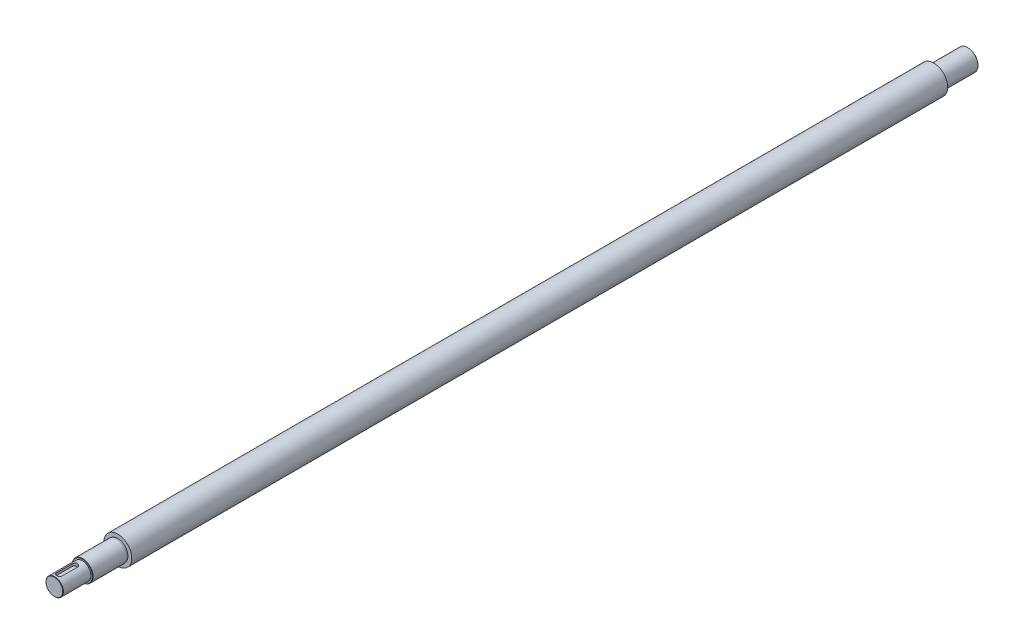
ISO-10303-21;
HEADER;
FILE_DESCRIPTION(('STEP AP214'),'2;1');
FILE_NAME('part.step','',(''),(''),'','','');
FILE_SCHEMA(('AUTOMOTIVE_DESIGN { 1 0 10303 214 1 1 1 1 }'));
ENDSEC;
DATA;
#1=APPLICATION_CONTEXT('core data for automotive mechanical design processes');
#2=APPLICATION_PROTOCOL_DEFINITION('international standard','automotive_design',2000,#1);
#3=PRODUCT_CONTEXT('',#1,'mechanical');
#4=PRODUCT('Part','Part','',(#3));
#5=PRODUCT_RELATED_PRODUCT_CATEGORY('part','',(#4));
#6=PRODUCT_DEFINITION_FORMATION('','',#4);
#7=PRODUCT_DEFINITION_CONTEXT('part definition',#1,'design');
#8=PRODUCT_DEFINITION('design','',#6,#7);
#9=PRODUCT_DEFINITION_SHAPE('','',#8);
#10=(LENGTH_UNIT() NAMED_UNIT(*) SI_UNIT(.MILLI.,.METRE.));
#11=(NAMED_UNIT(*) PLANE_ANGLE_UNIT() SI_UNIT($,.RADIAN.));
#12=(NAMED_UNIT(*) SI_UNIT($,.STERADIAN.) SOLID_ANGLE_UNIT());
#13=UNCERTAINTY_MEASURE_WITH_UNIT(LENGTH_MEASURE(1.E-05),#10,'distance_accuracy_value','');
#14=(GEOMETRIC_REPRESENTATION_CONTEXT(3) GLOBAL_UNCERTAINTY_ASSIGNED_CONTEXT((#13)) GLOBAL_UNIT_ASSIGNED_CONTEXT((#10,
#11,#12)) REPRESENTATION_CONTEXT('',''));
#15=CARTESIAN_POINT('',(0.,0.,0.));
#16=DIRECTION('',(0.,0.,1.));
#17=DIRECTION('',(1.,0.,0.));
#18=AXIS2_PLACEMENT_3D('',#15,#16,#17);
#19=CARTESIAN_POINT('',(0.,0.,40.));
#20=DIRECTION('',(0.,0.,-1.));
#21=DIRECTION('',(-1.,0.,0.));
#22=AXIS2_PLACEMENT_3D('',#19,#20,#21);
#23=CYLINDRICAL_SURFACE('',#22,12.5);
#24=DIRECTION('',(0.,0.,-1.));
#25=VECTOR('',#24,1.);
#26=CARTESIAN_POINT('',(4.,11.842719282327,40.));
#27=LINE('',#26,#25);
#28=CARTESIAN_POINT('',(4.,11.842719282327,11.));
#29=VERTEX_POINT('',#28);
#30=CARTESIAN_POINT('',(4.,11.842719282327,33.));
#31=VERTEX_POINT('',#30);
#32=EDGE_CURVE('E70',#29,#31,#27,.F.);
#33=ORIENTED_EDGE('',*,*,#32,.T.);
#34=CARTESIAN_POINT('',(4.,11.842719282327,33.));
#35=CARTESIAN_POINT('',(4.00001410484613,11.8427027366058,33.1093997719616));
#36=CARTESIAN_POINT('',(3.995512175201,11.8442348052368,33.2187902098479));
#37=CARTESIAN_POINT('',(3.9775860667845,11.8502730910574,33.4367282407365));
#38=CARTESIAN_POINT('',(3.96416412872571,11.8547785613244,33.5452760384845));
#39=CARTESIAN_POINT('',(3.9285572511943,11.8666242076309,33.7604610308455));
#40=CARTESIAN_POINT('',(3.9063967602145,11.8739564736691,33.8671026956112));
#41=CARTESIAN_POINT('',(3.85353581488657,11.8912164993788,34.0780056383716));
#42=CARTESIAN_POINT('',(3.82283508754056,11.90114434202,34.1822668401568));
#43=CARTESIAN_POINT('',(3.71831764495512,11.9343840843196,34.4903050042784));
#44=CARTESIAN_POINT('',(3.63203544139887,11.9611699822066,34.689636552068));
#45=CARTESIAN_POINT('',(3.42895021192288,12.0209583955878,35.0710125570418));
#46=CARTESIAN_POINT('',(3.31213030924909,12.0539643457894,35.2530473790497));
#47=CARTESIAN_POINT('',(3.0467850788479,12.123798407807,35.6012539885992));
#48=CARTESIAN_POINT('',(2.89735303896514,12.1607158548651,35.7667183243395));
#49=CARTESIAN_POINT('',(2.57296449846116,12.2334561140966,36.0707148485889));
#50=CARTESIAN_POINT('',(2.39800356343232,12.2692787347869,36.2092423483577));
#51=CARTESIAN_POINT('',(2.02237003010512,12.3368244653945,36.4586151983706));
#52=CARTESIAN_POINT('',(1.82118394546976,12.3684294972003,36.5687219564696));
#53=CARTESIAN_POINT('',(1.40197197350368,12.4229251649937,36.7532494953494));
#54=CARTESIAN_POINT('',(1.18395091903581,12.4458182908278,36.8276804737819));
#55=CARTESIAN_POINT('',(0.744713961063364,12.4796767811416,36.9363588642505));
#56=CARTESIAN_POINT('',(0.523827920101155,12.4910030499338,36.9718249333801));
#57=CARTESIAN_POINT('',(0.0789648151746392,12.5017287122873,37.0054327990416));
#58=CARTESIAN_POINT('',(-0.14501156419764,12.5011307063103,37.0035827335248));
#59=CARTESIAN_POINT('',(-0.581094974437689,12.4883236673358,36.9634011707287));
#60=CARTESIAN_POINT('',(-0.793338226675236,12.4765355800409,36.9263922320212));
#61=CARTESIAN_POINT('',(-1.2084232001272,12.443194578958,36.8191194483937));
#62=CARTESIAN_POINT('',(-1.41126440871778,12.4216411334261,36.7488537925672));
#63=CARTESIAN_POINT('',(-1.80478548808183,12.3706364987475,36.5762421577642));
#64=CARTESIAN_POINT('',(-1.99528012693526,12.3410893067347,36.4735034801312));
#65=CARTESIAN_POINT('',(-2.35673113106228,12.2771965403044,36.2391709509548));
#66=CARTESIAN_POINT('',(-2.5276825327575,12.2428497517893,36.107569793597));
#67=CARTESIAN_POINT('',(-2.85304511528221,12.1712409097156,35.8125534687084));
#68=CARTESIAN_POINT('',(-3.00641313381737,12.1339170352569,35.6480032974079));
#69=CARTESIAN_POINT('',(-3.28377291775701,12.0618172896256,35.2950280999147));
#70=CARTESIAN_POINT('',(-3.40775562728565,12.0270422062066,35.1065957411678));
#71=CARTESIAN_POINT('',(-3.56958208232606,11.9796198433082,34.8086287622514));
#72=CARTESIAN_POINT('',(-3.61975674493765,11.9645161845072,34.7060009407585));
#73=CARTESIAN_POINT('',(-3.71123075156255,11.9364591580623,34.4965952472483));
#74=CARTESIAN_POINT('',(-3.75253376401034,11.9235049021446,34.3898191122136));
#75=CARTESIAN_POINT('',(-3.82585831579178,11.9001802342949,34.1729866721084));
#76=CARTESIAN_POINT('',(-3.85788979915528,11.889807055759,34.0629340220269));
#77=CARTESIAN_POINT('',(-3.91241790563964,11.8719756673203,33.8403048430524));
#78=CARTESIAN_POINT('',(-3.93491889994975,11.8645161211931,33.7277294962026));
#79=CARTESIAN_POINT('',(-3.96832908530803,11.8533815888388,33.512760754139));
#80=CARTESIAN_POINT('',(-3.98020384564819,11.8493925948395,33.4105325842054));
#81=CARTESIAN_POINT('',(-3.9960393712768,11.8440568016292,33.2055389219667));
#82=CARTESIAN_POINT('',(-4.00001099551563,11.8427063770563,33.1027743617195));
#83=CARTESIAN_POINT('',(-4.,11.842719282327,33.));
#84=B_SPLINE_CURVE_WITH_KNOTS('',3,(#34,#35,#36,#37,#38,#39,#40,#41,#42,#43,#44,#45,#46,#47,#48,
#49,#50,#51,#52,#53,#54,#55,#56,#57,#58,#59,#60,#61,#62,#63,#64,#65,#66,#67,#68,#69,#70,#71,#72,
#73,#74,#75,#76,#77,#78,#79,#80,#81,#82,#83),.UNSPECIFIED.,.F.,.F.,(4,2,2,2,2,2,2,2,2,2,2,2,2,2,
2,2,2,2,2,2,2,2,2,2,4),(0.,0.328080176984104,0.656077971124942,0.98316453936822,1.310261564488,
1.96355293984248,2.61720612481382,3.29209427898756,3.96709980211697,4.65819584662374,
5.34909422856993,6.01770820975085,6.68617638029993,7.3304550155383,7.97476873730064,
8.6271932010581,9.27978300073407,9.96076419384898,10.6419549776068,10.9872862883783,
11.3324745283028,11.6772911585126,12.0219494657669,12.3305938648259,12.6388138912331),.UNSPECIFIED.);
#85=CARTESIAN_POINT('',(-4.,11.842719282327,33.));
#86=VERTEX_POINT('',#85);
#87=EDGE_CURVE('E141',#31,#86,#84,.T.);
#88=ORIENTED_EDGE('',*,*,#87,.T.);
#89=DIRECTION('',(0.,0.,-1.));
#90=VECTOR('',#89,1.);
#91=CARTESIAN_POINT('',(-4.,11.842719282327,40.));
#92=LINE('',#91,#90);
#93=CARTESIAN_POINT('',(-4.,11.842719282327,11.));
#94=VERTEX_POINT('',#93);
#95=EDGE_CURVE('E404',#86,#94,#92,.T.);
#96=ORIENTED_EDGE('',*,*,#95,.T.);
#97=CARTESIAN_POINT('',(-4.,11.842719282327,11.));
#98=CARTESIAN_POINT('',(-4.00001410484613,11.8427027366058,10.8906002280384));
#99=CARTESIAN_POINT('',(-3.995512175201,11.8442348052368,10.7812097901521));
#100=CARTESIAN_POINT('',(-3.97758606678449,11.8502730910574,10.5632717592635));
#101=CARTESIAN_POINT('',(-3.96416412872571,11.8547785613244,10.4547239615155));
#102=CARTESIAN_POINT('',(-3.92855725119429,11.8666242076309,10.2395389691545));
#103=CARTESIAN_POINT('',(-3.9063967602145,11.8739564736691,10.1328973043888));
#104=CARTESIAN_POINT('',(-3.85353581488656,11.8912164993788,9.92199436162844));
#105=CARTESIAN_POINT('',(-3.82283508754056,11.90114434202,9.81773315984322));
#106=CARTESIAN_POINT('',(-3.71831764495512,11.9343840843196,9.50969499572164));
#107=CARTESIAN_POINT('',(-3.63203544139887,11.9611699822066,9.31036344793197));
#108=CARTESIAN_POINT('',(-3.42895021192288,12.0209583955878,8.92898744295816));
#109=CARTESIAN_POINT('',(-3.31213030924909,12.0539643457894,8.74695262095034));
#110=CARTESIAN_POINT('',(-3.0467850788479,12.123798407807,8.39874601140078));
#111=CARTESIAN_POINT('',(-2.89735303896514,12.1607158548651,8.23328167566054));
#112=CARTESIAN_POINT('',(-2.57296449846116,12.2334561140966,7.92928515141109));
#113=CARTESIAN_POINT('',(-2.39800356343232,12.2692787347869,7.79075765164231));
#114=CARTESIAN_POINT('',(-2.02237003010512,12.3368244653945,7.54138480162945));
#115=CARTESIAN_POINT('',(-1.82118394546976,12.3684294972003,7.43127804353036));
#116=CARTESIAN_POINT('',(-1.40197197350368,12.4229251649937,7.24675050465061));
#117=CARTESIAN_POINT('',(-1.18395091903581,12.4458182908278,7.1723195262181));
#118=CARTESIAN_POINT('',(-0.744713961063364,12.4796767811416,7.0636411357495));
#119=CARTESIAN_POINT('',(-0.523827920101155,12.4910030499338,7.02817506661988));
#120=CARTESIAN_POINT('',(-0.0789648151746376,12.5017287122873,6.99456720095836));
#121=CARTESIAN_POINT('',(0.145011564197642,12.5011307063103,6.99641726647516));
#122=CARTESIAN_POINT('',(0.581094974437691,12.4883236673358,7.03659882927133));
#123=CARTESIAN_POINT('',(0.793338226675238,12.4765355800409,7.07360776797881));
#124=CARTESIAN_POINT('',(1.2084232001272,12.443194578958,7.18088055160631));
#125=CARTESIAN_POINT('',(1.41126440871778,12.4216411334261,7.2511462074328));
#126=CARTESIAN_POINT('',(1.80478548808183,12.3706364987475,7.42375784223576));
#127=CARTESIAN_POINT('',(1.99528012693527,12.3410893067347,7.52649651986879));
#128=CARTESIAN_POINT('',(2.35673113106229,12.2771965403044,7.76082904904521));
#129=CARTESIAN_POINT('',(2.5276825327575,12.2428497517893,7.89243020640298));
#130=CARTESIAN_POINT('',(2.85304511528221,12.1712409097156,8.18744653129155));
#131=CARTESIAN_POINT('',(3.00641313381737,12.1339170352569,8.3519967025921));
#132=CARTESIAN_POINT('',(3.28377291775701,12.0618172896256,8.7049719000853));
#133=CARTESIAN_POINT('',(3.40775562728565,12.0270422062066,8.89340425883215));
#134=CARTESIAN_POINT('',(3.56958208232607,11.9796198433082,9.19137123774859));
#135=CARTESIAN_POINT('',(3.61975674493765,11.9645161845072,9.29399905924154));
#136=CARTESIAN_POINT('',(3.71123075156255,11.9364591580623,9.50340475275169));
#137=CARTESIAN_POINT('',(3.75253376401034,11.9235049021446,9.61018088778641));
#138=CARTESIAN_POINT('',(3.82585831579178,11.9001802342949,9.82701332789163));
#139=CARTESIAN_POINT('',(3.85788979915529,11.889807055759,9.93706597797312));
#140=CARTESIAN_POINT('',(3.91241790563964,11.8719756673203,10.1596951569476));
#141=CARTESIAN_POINT('',(3.93491889994975,11.8645161211931,10.2722705037974));
#142=CARTESIAN_POINT('',(3.96832908530803,11.8533815888388,10.487239245861));
#143=CARTESIAN_POINT('',(3.9802038456482,11.8493925948395,10.5894674157946));
#144=CARTESIAN_POINT('',(3.99603937127681,11.8440568016292,10.7944610780333));
#145=CARTESIAN_POINT('',(4.00001099551563,11.8427063770563,10.8972256382805));
#146=CARTESIAN_POINT('',(4.,11.842719282327,11.));
#147=B_SPLINE_CURVE_WITH_KNOTS('',3,(#97,#98,#99,#100,#101,#102,#103,#104,#105,#106,#107,#108,
#109,#110,#111,#112,#113,#114,#115,#116,#117,#118,#119,#120,#121,#122,#123,#124,#125,#126,#127,
#128,#129,#130,#131,#132,#133,#134,#135,#136,#137,#138,#139,#140,#141,#142,#143,#144,#145,#146),
.UNSPECIFIED.,.F.,.F.,(4,2,2,2,2,2,2,2,2,2,2,2,2,2,2,2,2,2,2,2,2,2,2,2,4),(0.,0.328080176984102,
0.656077971124948,0.983164539368217,1.310261564488,1.96355293984248,2.61720612481382,
3.29209427898756,3.96709980211697,4.65819584662373,5.34909422856993,6.01770820975085,
6.68617638029994,7.3304550155383,7.97476873730065,8.6271932010581,9.27978300073407,
9.96076419384897,10.6419549776068,10.9872862883783,11.3324745283028,11.6772911585126,
12.0219494657669,12.3305938648259,12.6388138912331),.UNSPECIFIED.);
#148=EDGE_CURVE('E62',#94,#29,#147,.T.);
#149=ORIENTED_EDGE('',*,*,#148,.T.);
#150=EDGE_LOOP('',(#33,#88,#96,#149));
#151=FACE_BOUND('',#150,.T.);
#152=CARTESIAN_POINT('',(0.,0.,39.5));
#153=DIRECTION('',(0.,0.,1.));
#154=DIRECTION('',(1.,0.,0.));
#155=AXIS2_PLACEMENT_3D('',#152,#153,#154);
#156=CIRCLE('',#155,12.5);
#157=CARTESIAN_POINT('',(12.5,0.,39.5));
#158=VERTEX_POINT('',#157);
#159=EDGE_CURVE('E137',#158,#158,#156,.F.);
#160=ORIENTED_EDGE('',*,*,#159,.T.);
#161=EDGE_LOOP('',(#160));
#162=FACE_BOUND('',#161,.T.);
#163=CARTESIAN_POINT('',(0.,0.,0.));
#164=DIRECTION('',(0.,0.,1.));
#165=DIRECTION('',(1.,0.,0.));
#166=AXIS2_PLACEMENT_3D('',#163,#164,#165);
#167=CIRCLE('',#166,12.5);
#168=CARTESIAN_POINT('',(12.5,0.,0.));
#169=VERTEX_POINT('',#168);
#170=EDGE_CURVE('E112',#169,#169,#167,.T.);
#171=ORIENTED_EDGE('',*,*,#170,.T.);
#172=EDGE_LOOP('',(#171));
#173=FACE_BOUND('',#172,.T.);
#174=ADVANCED_FACE('F45',(#151,#162,#173),#23,.T.);
#175=CARTESIAN_POINT('',(0.,0.,40.));
#176=DIRECTION('',(0.,0.,1.));
#177=DIRECTION('',(1.,0.,0.));
#178=AXIS2_PLACEMENT_3D('',#175,#176,#177);
#179=PLANE('',#178);
#180=CARTESIAN_POINT('',(0.,0.,40.));
#181=DIRECTION('',(0.,0.,1.));
#182=DIRECTION('',(1.,0.,0.));
#183=AXIS2_PLACEMENT_3D('',#180,#181,#182);
#184=CIRCLE('',#183,12.);
#185=CARTESIAN_POINT('',(12.,0.,40.));
#186=VERTEX_POINT('',#185);
#187=EDGE_CURVE('E128',#186,#186,#184,.T.);
#188=ORIENTED_EDGE('',*,*,#187,.T.);
#189=EDGE_LOOP('',(#188));
#190=FACE_BOUND('',#189,.T.);
#191=ADVANCED_FACE('F172',(#190),#179,.T.);
#192=CARTESIAN_POINT('',(0.,0.,40.));
#193=DIRECTION('',(0.,0.,-1.));
#194=DIRECTION('',(-1.,0.,0.));
#195=AXIS2_PLACEMENT_3D('',#192,#193,#194);
#196=CONICAL_SURFACE('',#195,12.,0.785398163397443);
#197=ORIENTED_EDGE('',*,*,#159,.F.);
#198=EDGE_LOOP('',(#197));
#199=FACE_BOUND('',#198,.T.);
#200=ORIENTED_EDGE('',*,*,#187,.F.);
#201=EDGE_LOOP('',(#200));
#202=FACE_BOUND('',#201,.T.);
#203=ADVANCED_FACE('F171',(#199,#202),#196,.T.);
#204=CARTESIAN_POINT('',(0.,8.5,11.));
#205=DIRECTION('',(0.,1.,0.));
#206=DIRECTION('',(0.,0.,1.));
#207=AXIS2_PLACEMENT_3D('',#204,#205,#206);
#208=CYLINDRICAL_SURFACE('',#207,4.);
#209=DIRECTION('',(0.,1.,0.));
#210=VECTOR('',#209,1.);
#211=CARTESIAN_POINT('',(-4.,8.5,11.));
#212=LINE('',#211,#210);
#213=CARTESIAN_POINT('',(-4.,8.5,11.));
#214=VERTEX_POINT('',#213);
#215=EDGE_CURVE('E87',#214,#94,#212,.T.);
#216=ORIENTED_EDGE('',*,*,#215,.F.);
#217=CARTESIAN_POINT('',(0.,8.5,11.));
#218=DIRECTION('',(0.,1.,0.));
#219=DIRECTION('',(0.,0.,1.));
#220=AXIS2_PLACEMENT_3D('',#217,#218,#219);
#221=CIRCLE('',#220,4.);
#222=CARTESIAN_POINT('',(4.,8.5,11.));
#223=VERTEX_POINT('',#222);
#224=EDGE_CURVE('E91',#223,#214,#221,.T.);
#225=ORIENTED_EDGE('',*,*,#224,.F.);
#226=DIRECTION('',(0.,1.,0.));
#227=VECTOR('',#226,1.);
#228=CARTESIAN_POINT('',(4.,8.5,11.));
#229=LINE('',#228,#227);
#230=EDGE_CURVE('E125',#223,#29,#229,.T.);
#231=ORIENTED_EDGE('',*,*,#230,.T.);
#232=ORIENTED_EDGE('',*,*,#148,.F.);
#233=EDGE_LOOP('',(#216,#225,#231,#232));
#234=FACE_BOUND('',#233,.T.);
#235=ADVANCED_FACE('F89',(#234),#208,.F.);
#236=CARTESIAN_POINT('',(4.,8.5,11.));
#237=DIRECTION('',(1.,0.,0.));
#238=DIRECTION('',(0.,0.,-1.));
#239=AXIS2_PLACEMENT_3D('',#236,#237,#238);
#240=PLANE('',#239);
#241=ORIENTED_EDGE('',*,*,#230,.F.);
#242=DIRECTION('',(0.,0.,-1.));
#243=VECTOR('',#242,1.);
#244=CARTESIAN_POINT('',(4.,8.5,11.));
#245=LINE('',#244,#243);
#246=CARTESIAN_POINT('',(4.,8.5,33.));
#247=VERTEX_POINT('',#246);
#248=EDGE_CURVE('E97',#247,#223,#245,.T.);
#249=ORIENTED_EDGE('',*,*,#248,.F.);
#250=DIRECTION('',(0.,1.,0.));
#251=VECTOR('',#250,1.);
#252=CARTESIAN_POINT('',(4.,8.5,33.));
#253=LINE('',#252,#251);
#254=EDGE_CURVE('E129',#247,#31,#253,.T.);
#255=ORIENTED_EDGE('',*,*,#254,.T.);
#256=ORIENTED_EDGE('',*,*,#32,.F.);
#257=EDGE_LOOP('',(#241,#249,#255,#256));
#258=FACE_BOUND('',#257,.T.);
#259=ADVANCED_FACE('F165',(#258),#240,.F.);
#260=CARTESIAN_POINT('',(0.,8.5,33.));
#261=DIRECTION('',(0.,1.,0.));
#262=DIRECTION('',(0.,0.,1.));
#263=AXIS2_PLACEMENT_3D('',#260,#261,#262);
#264=CYLINDRICAL_SURFACE('',#263,4.);
#265=ORIENTED_EDGE('',*,*,#254,.F.);
#266=CARTESIAN_POINT('',(0.,8.5,33.));
#267=DIRECTION('',(0.,1.,0.));
#268=DIRECTION('',(0.,0.,1.));
#269=AXIS2_PLACEMENT_3D('',#266,#267,#268);
#270=CIRCLE('',#269,4.);
#271=CARTESIAN_POINT('',(-4.,8.5,33.));
#272=VERTEX_POINT('',#271);
#273=EDGE_CURVE('E107',#272,#247,#270,.T.);
#274=ORIENTED_EDGE('',*,*,#273,.F.);
#275=DIRECTION('',(0.,1.,0.));
#276=VECTOR('',#275,1.);
#277=CARTESIAN_POINT('',(-4.,8.5,33.));
#278=LINE('',#277,#276);
#279=EDGE_CURVE('E96',#272,#86,#278,.T.);
#280=ORIENTED_EDGE('',*,*,#279,.T.);
#281=ORIENTED_EDGE('',*,*,#87,.F.);
#282=EDGE_LOOP('',(#265,#274,#280,#281));
#283=FACE_BOUND('',#282,.T.);
#284=ADVANCED_FACE('F160',(#283),#264,.F.);
#285=CARTESIAN_POINT('',(-4.,8.5,11.));
#286=DIRECTION('',(-1.,0.,0.));
#287=DIRECTION('',(0.,0.,1.));
#288=AXIS2_PLACEMENT_3D('',#285,#286,#287);
#289=PLANE('',#288);
#290=ORIENTED_EDGE('',*,*,#279,.F.);
#291=DIRECTION('',(0.,0.,1.));
#292=VECTOR('',#291,1.);
#293=CARTESIAN_POINT('',(-4.,8.5,11.));
#294=LINE('',#293,#292);
#295=EDGE_CURVE('E100',#214,#272,#294,.T.);
#296=ORIENTED_EDGE('',*,*,#295,.F.);
#297=ORIENTED_EDGE('',*,*,#215,.T.);
#298=ORIENTED_EDGE('',*,*,#95,.F.);
#299=EDGE_LOOP('',(#290,#296,#297,#298));
#300=FACE_BOUND('',#299,.T.);
#301=ADVANCED_FACE('F101',(#300),#289,.F.);
#302=CARTESIAN_POINT('',(0.,8.5,11.));
#303=DIRECTION('',(0.,1.,0.));
#304=DIRECTION('',(0.,0.,1.));
#305=AXIS2_PLACEMENT_3D('',#302,#303,#304);
#306=PLANE('',#305);
#307=ORIENTED_EDGE('',*,*,#224,.T.);
#308=ORIENTED_EDGE('',*,*,#295,.T.);
#309=ORIENTED_EDGE('',*,*,#273,.T.);
#310=ORIENTED_EDGE('',*,*,#248,.T.);
#311=EDGE_LOOP('',(#307,#308,#309,#310));
#312=FACE_BOUND('',#311,.T.);
#313=ADVANCED_FACE('F109',(#312),#306,.T.);
#314=CARTESIAN_POINT('',(0.,0.,-49.));
#315=DIRECTION('',(0.,0.,1.));
#316=DIRECTION('',(1.,0.,0.));
#317=AXIS2_PLACEMENT_3D('',#314,#315,#316);
#318=CYLINDRICAL_SURFACE('',#317,15.);
#319=CARTESIAN_POINT('',(0.,0.,-0.499999999999994));
#320=DIRECTION('',(0.,0.,-1.));
#321=DIRECTION('',(-1.,0.,0.));
#322=AXIS2_PLACEMENT_3D('',#319,#320,#321);
#323=CIRCLE('',#322,15.);
#324=CARTESIAN_POINT('',(-15.,0.,-0.499999999999994));
#325=VERTEX_POINT('',#324);
#326=EDGE_CURVE('E408',#325,#325,#323,.T.);
#327=ORIENTED_EDGE('',*,*,#326,.T.);
#328=EDGE_LOOP('',(#327));
#329=FACE_BOUND('',#328,.T.);
#330=CARTESIAN_POINT('',(0.,0.,-49.));
#331=DIRECTION('',(0.,0.,-1.));
#332=DIRECTION('',(-1.,0.,0.));
#333=AXIS2_PLACEMENT_3D('',#330,#331,#332);
#334=CIRCLE('',#333,15.);
#335=CARTESIAN_POINT('',(-15.,0.,-49.));
#336=VERTEX_POINT('',#335);
#337=EDGE_CURVE('E116',#336,#336,#334,.T.);
#338=ORIENTED_EDGE('',*,*,#337,.F.);
#339=EDGE_LOOP('',(#338));
#340=FACE_BOUND('',#339,.T.);
#341=ADVANCED_FACE('F202',(#329,#340),#318,.T.);
#342=CARTESIAN_POINT('',(0.,0.,-49.));
#343=DIRECTION('',(0.,0.,-1.));
#344=DIRECTION('',(-1.,0.,0.));
#345=AXIS2_PLACEMENT_3D('',#342,#343,#344);
#346=PLANE('',#345);
#347=CARTESIAN_POINT('',(0.,0.,-49.));
#348=DIRECTION('',(0.,0.,-1.));
#349=DIRECTION('',(-1.,0.,0.));
#350=AXIS2_PLACEMENT_3D('',#347,#348,#349);
#351=CIRCLE('',#350,14.5);
#352=CARTESIAN_POINT('',(-14.5,0.,-49.));
#353=VERTEX_POINT('',#352);
#354=EDGE_CURVE('E416',#353,#353,#351,.T.);
#355=ORIENTED_EDGE('',*,*,#354,.F.);
#356=EDGE_LOOP('',(#355));
#357=FACE_BOUND('',#356,.T.);
#358=ORIENTED_EDGE('',*,*,#337,.T.);
#359=EDGE_LOOP('',(#358));
#360=FACE_BOUND('',#359,.T.);
#361=ADVANCED_FACE('F193',(#357,#360),#346,.T.);
#362=CARTESIAN_POINT('',(0.,0.,0.));
#363=DIRECTION('',(0.,0.,-1.));
#364=DIRECTION('',(-1.,0.,0.));
#365=AXIS2_PLACEMENT_3D('',#362,#363,#364);
#366=PLANE('',#365);
#367=CARTESIAN_POINT('',(0.,0.,0.));
#368=DIRECTION('',(0.,0.,-1.));
#369=DIRECTION('',(-1.,0.,0.));
#370=AXIS2_PLACEMENT_3D('',#367,#368,#369);
#371=CIRCLE('',#370,14.5);
#372=CARTESIAN_POINT('',(-14.5,0.,0.));
#373=VERTEX_POINT('',#372);
#374=EDGE_CURVE('E414',#373,#373,#371,.F.);
#375=ORIENTED_EDGE('',*,*,#374,.T.);
#376=EDGE_LOOP('',(#375));
#377=FACE_BOUND('',#376,.T.);
#378=ORIENTED_EDGE('',*,*,#170,.F.);
#379=EDGE_LOOP('',(#378));
#380=FACE_BOUND('',#379,.T.);
#381=ADVANCED_FACE('F190',(#377,#380),#366,.F.);
#382=CARTESIAN_POINT('',(0.,0.,-0.499999999999994));
#383=DIRECTION('',(0.,0.,-1.));
#384=DIRECTION('',(-1.,0.,0.));
#385=AXIS2_PLACEMENT_3D('',#382,#383,#384);
#386=CONICAL_SURFACE('',#385,15.,0.785398163397453);
#387=ORIENTED_EDGE('',*,*,#374,.F.);
#388=EDGE_LOOP('',(#387));
#389=FACE_BOUND('',#388,.T.);
#390=ORIENTED_EDGE('',*,*,#326,.F.);
#391=EDGE_LOOP('',(#390));
#392=FACE_BOUND('',#391,.T.);
#393=ADVANCED_FACE('F192',(#389,#392),#386,.T.);
#394=CARTESIAN_POINT('',(0.,0.,-51.));
#395=DIRECTION('',(0.,0.,1.));
#396=DIRECTION('',(1.,0.,0.));
#397=AXIS2_PLACEMENT_3D('',#394,#395,#396);
#398=CYLINDRICAL_SURFACE('',#397,14.5);
#399=CARTESIAN_POINT('',(0.,0.,-51.));
#400=DIRECTION('',(0.,0.,-1.));
#401=DIRECTION('',(-1.,0.,0.));
#402=AXIS2_PLACEMENT_3D('',#399,#400,#401);
#403=CIRCLE('',#402,14.5);
#404=CARTESIAN_POINT('',(-14.5,0.,-51.));
#405=VERTEX_POINT('',#404);
#406=EDGE_CURVE('E436',#405,#405,#403,.T.);
#407=ORIENTED_EDGE('',*,*,#406,.F.);
#408=EDGE_LOOP('',(#407));
#409=FACE_BOUND('',#408,.T.);
#410=ORIENTED_EDGE('',*,*,#354,.T.);
#411=EDGE_LOOP('',(#410));
#412=FACE_BOUND('',#411,.T.);
#413=ADVANCED_FACE('F200',(#409,#412),#398,.T.);
#414=CARTESIAN_POINT('',(0.,0.,-1221.));
#415=DIRECTION('',(0.,0.,1.));
#416=DIRECTION('',(1.,0.,0.));
#417=AXIS2_PLACEMENT_3D('',#414,#415,#416);
#418=CYLINDRICAL_SURFACE('',#417,20.);
#419=CARTESIAN_POINT('',(0.,0.,-1221.));
#420=DIRECTION('',(0.,0.,-1.));
#421=DIRECTION('',(-1.,0.,0.));
#422=AXIS2_PLACEMENT_3D('',#419,#420,#421);
#423=CIRCLE('',#422,20.);
#424=CARTESIAN_POINT('',(-20.,0.,-1221.));
#425=VERTEX_POINT('',#424);
#426=EDGE_CURVE('E432',#425,#425,#423,.T.);
#427=ORIENTED_EDGE('',*,*,#426,.F.);
#428=EDGE_LOOP('',(#427));
#429=FACE_BOUND('',#428,.T.);
#430=CARTESIAN_POINT('',(0.,0.,-51.));
#431=DIRECTION('',(0.,0.,-1.));
#432=DIRECTION('',(-1.,0.,0.));
#433=AXIS2_PLACEMENT_3D('',#430,#431,#432);
#434=CIRCLE('',#433,20.);
#435=CARTESIAN_POINT('',(-20.,0.,-51.));
#436=VERTEX_POINT('',#435);
#437=EDGE_CURVE('E437',#436,#436,#434,.T.);
#438=ORIENTED_EDGE('',*,*,#437,.T.);
#439=EDGE_LOOP('',(#438));
#440=FACE_BOUND('',#439,.T.);
#441=ADVANCED_FACE('F237',(#429,#440),#418,.T.);
#442=CARTESIAN_POINT('',(0.,0.,-1221.));
#443=DIRECTION('',(0.,0.,-1.));
#444=DIRECTION('',(-1.,0.,0.));
#445=AXIS2_PLACEMENT_3D('',#442,#443,#444);
#446=PLANE('',#445);
#447=CARTESIAN_POINT('',(0.,0.,-1221.));
#448=DIRECTION('',(0.,0.,-1.));
#449=DIRECTION('',(-1.,0.,0.));
#450=AXIS2_PLACEMENT_3D('',#447,#448,#449);
#451=CIRCLE('',#450,14.5);
#452=CARTESIAN_POINT('',(-14.5,0.,-1221.));
#453=VERTEX_POINT('',#452);
#454=EDGE_CURVE('E419',#453,#453,#451,.T.);
#455=ORIENTED_EDGE('',*,*,#454,.F.);
#456=EDGE_LOOP('',(#455));
#457=FACE_BOUND('',#456,.T.);
#458=ORIENTED_EDGE('',*,*,#426,.T.);
#459=EDGE_LOOP('',(#458));
#460=FACE_BOUND('',#459,.T.);
#461=ADVANCED_FACE('F247',(#457,#460),#446,.T.);
#462=CARTESIAN_POINT('',(0.,0.,-51.));
#463=DIRECTION('',(0.,0.,-1.));
#464=DIRECTION('',(-1.,0.,0.));
#465=AXIS2_PLACEMENT_3D('',#462,#463,#464);
#466=PLANE('',#465);
#467=ORIENTED_EDGE('',*,*,#406,.T.);
#468=EDGE_LOOP('',(#467));
#469=FACE_BOUND('',#468,.T.);
#470=ORIENTED_EDGE('',*,*,#437,.F.);
#471=EDGE_LOOP('',(#470));
#472=FACE_BOUND('',#471,.T.);
#473=ADVANCED_FACE('F256',(#469,#472),#466,.F.);
#474=CARTESIAN_POINT('',(0.,0.,-1223.));
#475=DIRECTION('',(0.,0.,1.));
#476=DIRECTION('',(1.,0.,0.));
#477=AXIS2_PLACEMENT_3D('',#474,#475,#476);
#478=CYLINDRICAL_SURFACE('',#477,14.5);
#479=CARTESIAN_POINT('',(0.,0.,-1223.));
#480=DIRECTION('',(0.,0.,-1.));
#481=DIRECTION('',(-1.,0.,0.));
#482=AXIS2_PLACEMENT_3D('',#479,#480,#481);
#483=CIRCLE('',#482,14.5);
#484=CARTESIAN_POINT('',(-14.5,0.,-1223.));
#485=VERTEX_POINT('',#484);
#486=EDGE_CURVE('E430',#485,#485,#483,.T.);
#487=ORIENTED_EDGE('',*,*,#486,.F.);
#488=EDGE_LOOP('',(#487));
#489=FACE_BOUND('',#488,.T.);
#490=ORIENTED_EDGE('',*,*,#454,.T.);
#491=EDGE_LOOP('',(#490));
#492=FACE_BOUND('',#491,.T.);
#493=ADVANCED_FACE('F261',(#489,#492),#478,.T.);
#494=CARTESIAN_POINT('',(0.,0.,-1270.));
#495=DIRECTION('',(0.,0.,1.));
#496=DIRECTION('',(1.,0.,0.));
#497=AXIS2_PLACEMENT_3D('',#494,#495,#496);
#498=CYLINDRICAL_SURFACE('',#497,15.);
#499=CARTESIAN_POINT('',(0.,0.,-1269.5));
#500=DIRECTION('',(0.,0.,-1.));
#501=DIRECTION('',(-1.,0.,0.));
#502=AXIS2_PLACEMENT_3D('',#499,#500,#501);
#503=CIRCLE('',#502,15.);
#504=CARTESIAN_POINT('',(-15.,0.,-1269.5));
#505=VERTEX_POINT('',#504);
#506=EDGE_CURVE('E11',#505,#505,#503,.F.);
#507=ORIENTED_EDGE('',*,*,#506,.T.);
#508=EDGE_LOOP('',(#507));
#509=FACE_BOUND('',#508,.T.);
#510=CARTESIAN_POINT('',(0.,0.,-1223.));
#511=DIRECTION('',(0.,0.,-1.));
#512=DIRECTION('',(-1.,0.,0.));
#513=AXIS2_PLACEMENT_3D('',#510,#511,#512);
#514=CIRCLE('',#513,15.);
#515=CARTESIAN_POINT('',(-15.,0.,-1223.));
#516=VERTEX_POINT('',#515);
#517=EDGE_CURVE('E457',#516,#516,#514,.T.);
#518=ORIENTED_EDGE('',*,*,#517,.T.);
#519=EDGE_LOOP('',(#518));
#520=FACE_BOUND('',#519,.T.);
#521=ADVANCED_FACE('F280',(#509,#520),#498,.T.);
#522=CARTESIAN_POINT('',(0.,0.,-1270.));
#523=DIRECTION('',(0.,0.,-1.));
#524=DIRECTION('',(-1.,0.,0.));
#525=AXIS2_PLACEMENT_3D('',#522,#523,#524);
#526=PLANE('',#525);
#527=CARTESIAN_POINT('',(0.,0.,-1270.));
#528=DIRECTION('',(0.,0.,-1.));
#529=DIRECTION('',(-1.,0.,0.));
#530=AXIS2_PLACEMENT_3D('',#527,#528,#529);
#531=CIRCLE('',#530,14.5000000000002);
#532=CARTESIAN_POINT('',(-14.5000000000002,0.,-1270.));
#533=VERTEX_POINT('',#532);
#534=EDGE_CURVE('E55',#533,#533,#531,.T.);
#535=ORIENTED_EDGE('',*,*,#534,.T.);
#536=EDGE_LOOP('',(#535));
#537=FACE_BOUND('',#536,.T.);
#538=ADVANCED_FACE('F294',(#537),#526,.T.);
#539=CARTESIAN_POINT('',(0.,0.,-1223.));
#540=DIRECTION('',(0.,0.,-1.));
#541=DIRECTION('',(-1.,0.,0.));
#542=AXIS2_PLACEMENT_3D('',#539,#540,#541);
#543=PLANE('',#542);
#544=ORIENTED_EDGE('',*,*,#486,.T.);
#545=EDGE_LOOP('',(#544));
#546=FACE_BOUND('',#545,.T.);
#547=ORIENTED_EDGE('',*,*,#517,.F.);
#548=EDGE_LOOP('',(#547));
#549=FACE_BOUND('',#548,.T.);
#550=ADVANCED_FACE('F289',(#546,#549),#543,.F.);
#551=CARTESIAN_POINT('',(0.,0.,-1270.));
#552=DIRECTION('',(0.,0.,1.));
#553=DIRECTION('',(1.,0.,0.));
#554=AXIS2_PLACEMENT_3D('',#551,#552,#553);
#555=CONICAL_SURFACE('',#554,14.5000000000002,0.785398163397325);
#556=ORIENTED_EDGE('',*,*,#506,.F.);
#557=EDGE_LOOP('',(#556));
#558=FACE_BOUND('',#557,.T.);
#559=ORIENTED_EDGE('',*,*,#534,.F.);
#560=EDGE_LOOP('',(#559));
#561=FACE_BOUND('',#560,.T.);
#562=ADVANCED_FACE('F48',(#558,#561),#555,.T.);
#563=CLOSED_SHELL('',(#174,#191,#203,#235,#259,#284,#301,#313,#341,#361,#381,#393,#413,#441,
#461,#473,#493,#521,#538,#550,#562));
#564=MANIFOLD_SOLID_BREP('B2',#563);
#565=ADVANCED_BREP_SHAPE_REPRESENTATION('',(#18,#564),#14);
#566=SHAPE_DEFINITION_REPRESENTATION(#9,#565);
ENDSEC;
END-ISO-10303-21;
